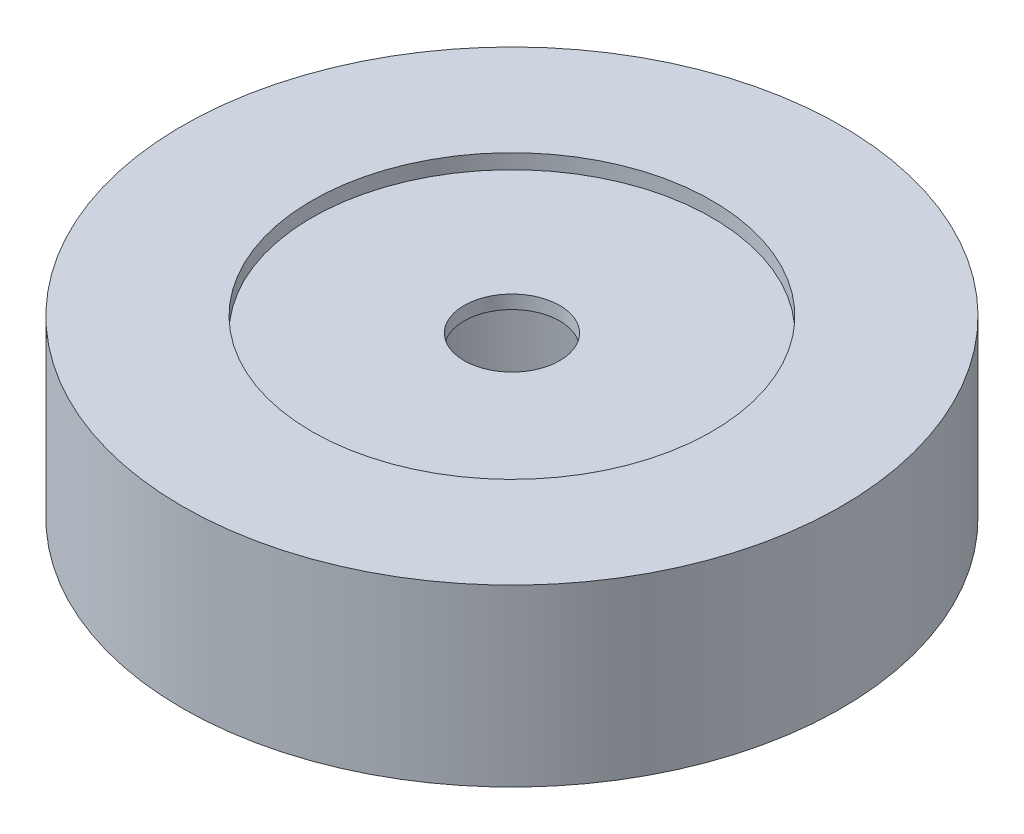
ISO-10303-21;
HEADER;
FILE_DESCRIPTION(('STEP AP214'),'2;1');
FILE_NAME('part.step','',(''),(''),'','','');
FILE_SCHEMA(('AUTOMOTIVE_DESIGN { 1 0 10303 214 1 1 1 1 }'));
ENDSEC;
DATA;
#1=APPLICATION_CONTEXT('core data for automotive mechanical design processes');
#2=APPLICATION_PROTOCOL_DEFINITION('international standard','automotive_design',2000,#1);
#3=PRODUCT_CONTEXT('',#1,'mechanical');
#4=PRODUCT('Part','Part','',(#3));
#5=PRODUCT_RELATED_PRODUCT_CATEGORY('part','',(#4));
#6=PRODUCT_DEFINITION_FORMATION('','',#4);
#7=PRODUCT_DEFINITION_CONTEXT('part definition',#1,'design');
#8=PRODUCT_DEFINITION('design','',#6,#7);
#9=PRODUCT_DEFINITION_SHAPE('','',#8);
#10=(LENGTH_UNIT() NAMED_UNIT(*) SI_UNIT(.MILLI.,.METRE.));
#11=(NAMED_UNIT(*) PLANE_ANGLE_UNIT() SI_UNIT($,.RADIAN.));
#12=(NAMED_UNIT(*) SI_UNIT($,.STERADIAN.) SOLID_ANGLE_UNIT());
#13=UNCERTAINTY_MEASURE_WITH_UNIT(LENGTH_MEASURE(1.E-05),#10,'distance_accuracy_value','');
#14=(GEOMETRIC_REPRESENTATION_CONTEXT(3) GLOBAL_UNCERTAINTY_ASSIGNED_CONTEXT((#13)) GLOBAL_UNIT_ASSIGNED_CONTEXT((#10,
#11,#12)) REPRESENTATION_CONTEXT('',''));
#15=CARTESIAN_POINT('',(0.,0.,0.));
#16=DIRECTION('',(0.,0.,1.));
#17=DIRECTION('',(1.,0.,0.));
#18=AXIS2_PLACEMENT_3D('',#15,#16,#17);
#19=CARTESIAN_POINT('',(0.,120.65,0.));
#20=DIRECTION('',(0.,-1.,0.));
#21=DIRECTION('',(0.,0.,-1.));
#22=AXIS2_PLACEMENT_3D('',#19,#20,#21);
#23=CYLINDRICAL_SURFACE('',#22,33.);
#24=CARTESIAN_POINT('',(0.,101.22,0.));
#25=DIRECTION('',(0.,-1.,0.));
#26=DIRECTION('',(0.,0.,-1.));
#27=AXIS2_PLACEMENT_3D('',#24,#25,#26);
#28=CIRCLE('',#27,33.);
#29=CARTESIAN_POINT('',(0.,101.22,-33.));
#30=VERTEX_POINT('',#29);
#31=EDGE_CURVE('E58',#30,#30,#28,.T.);
#32=ORIENTED_EDGE('',*,*,#31,.T.);
#33=EDGE_LOOP('',(#32));
#34=FACE_BOUND('',#33,.T.);
#35=CARTESIAN_POINT('',(0.,110.49,0.));
#36=DIRECTION('',(0.,1.,0.));
#37=DIRECTION('',(0.,0.,1.));
#38=AXIS2_PLACEMENT_3D('',#35,#36,#37);
#39=CIRCLE('',#38,33.);
#40=CARTESIAN_POINT('',(0.,110.49,33.));
#41=VERTEX_POINT('',#40);
#42=EDGE_CURVE('E47',#41,#41,#39,.T.);
#43=ORIENTED_EDGE('',*,*,#42,.T.);
#44=EDGE_LOOP('',(#43));
#45=FACE_BOUND('',#44,.T.);
#46=ADVANCED_FACE('F43',(#34,#45),#23,.F.);
#47=CARTESIAN_POINT('',(0.,120.65,0.));
#48=DIRECTION('',(0.,1.,0.));
#49=DIRECTION('',(0.,0.,1.));
#50=AXIS2_PLACEMENT_3D('',#47,#48,#49);
#51=PLANE('',#50);
#52=CARTESIAN_POINT('',(0.,120.65,0.));
#53=DIRECTION('',(0.,1.,0.));
#54=DIRECTION('',(0.,0.,1.));
#55=AXIS2_PLACEMENT_3D('',#52,#53,#54);
#56=CIRCLE('',#55,138.);
#57=CARTESIAN_POINT('',(0.,120.65,138.));
#58=VERTEX_POINT('',#57);
#59=EDGE_CURVE('E75',#58,#58,#56,.T.);
#60=ORIENTED_EDGE('',*,*,#59,.F.);
#61=EDGE_LOOP('',(#60));
#62=FACE_BOUND('',#61,.T.);
#63=CARTESIAN_POINT('',(0.,120.65,0.));
#64=DIRECTION('',(0.,1.,0.));
#65=DIRECTION('',(0.,0.,1.));
#66=AXIS2_PLACEMENT_3D('',#63,#64,#65);
#67=CIRCLE('',#66,227.33);
#68=CARTESIAN_POINT('',(0.,120.65,227.33));
#69=VERTEX_POINT('',#68);
#70=EDGE_CURVE('E10',#69,#69,#67,.T.);
#71=ORIENTED_EDGE('',*,*,#70,.T.);
#72=EDGE_LOOP('',(#71));
#73=FACE_BOUND('',#72,.T.);
#74=ADVANCED_FACE('F100',(#62,#73),#51,.T.);
#75=CARTESIAN_POINT('',(0.,0.,0.));
#76=DIRECTION('',(0.,1.,0.));
#77=DIRECTION('',(0.,0.,1.));
#78=AXIS2_PLACEMENT_3D('',#75,#76,#77);
#79=PLANE('',#78);
#80=CARTESIAN_POINT('',(0.,0.,0.));
#81=DIRECTION('',(0.,-1.,0.));
#82=DIRECTION('',(0.,0.,-1.));
#83=AXIS2_PLACEMENT_3D('',#80,#81,#82);
#84=CIRCLE('',#83,120.5);
#85=CARTESIAN_POINT('',(0.,0.,-120.5));
#86=VERTEX_POINT('',#85);
#87=EDGE_CURVE('E61',#86,#86,#84,.T.);
#88=ORIENTED_EDGE('',*,*,#87,.F.);
#89=EDGE_LOOP('',(#88));
#90=FACE_BOUND('',#89,.T.);
#91=CARTESIAN_POINT('',(0.,0.,0.));
#92=DIRECTION('',(0.,1.,0.));
#93=DIRECTION('',(0.,0.,1.));
#94=AXIS2_PLACEMENT_3D('',#91,#92,#93);
#95=CIRCLE('',#94,227.33);
#96=CARTESIAN_POINT('',(0.,0.,227.33));
#97=VERTEX_POINT('',#96);
#98=EDGE_CURVE('E52',#97,#97,#95,.T.);
#99=ORIENTED_EDGE('',*,*,#98,.F.);
#100=EDGE_LOOP('',(#99));
#101=FACE_BOUND('',#100,.T.);
#102=ADVANCED_FACE('F106',(#90,#101),#79,.F.);
#103=CARTESIAN_POINT('',(0.,120.65,0.));
#104=DIRECTION('',(0.,-1.,0.));
#105=DIRECTION('',(0.,0.,-1.));
#106=AXIS2_PLACEMENT_3D('',#103,#104,#105);
#107=CYLINDRICAL_SURFACE('',#106,227.33);
#108=ORIENTED_EDGE('',*,*,#70,.F.);
#109=EDGE_LOOP('',(#108));
#110=FACE_BOUND('',#109,.T.);
#111=ORIENTED_EDGE('',*,*,#98,.T.);
#112=EDGE_LOOP('',(#111));
#113=FACE_BOUND('',#112,.T.);
#114=ADVANCED_FACE('F45',(#110,#113),#107,.T.);
#115=CARTESIAN_POINT('',(0.,101.22,0.));
#116=DIRECTION('',(0.,-1.,0.));
#117=DIRECTION('',(0.,0.,-1.));
#118=AXIS2_PLACEMENT_3D('',#115,#116,#117);
#119=CYLINDRICAL_SURFACE('',#118,120.5);
#120=CARTESIAN_POINT('',(0.,101.22,0.));
#121=DIRECTION('',(0.,-1.,0.));
#122=DIRECTION('',(0.,0.,-1.));
#123=AXIS2_PLACEMENT_3D('',#120,#121,#122);
#124=CIRCLE('',#123,120.5);
#125=CARTESIAN_POINT('',(0.,101.22,-120.5));
#126=VERTEX_POINT('',#125);
#127=EDGE_CURVE('E65',#126,#126,#124,.T.);
#128=ORIENTED_EDGE('',*,*,#127,.F.);
#129=EDGE_LOOP('',(#128));
#130=FACE_BOUND('',#129,.T.);
#131=ORIENTED_EDGE('',*,*,#87,.T.);
#132=EDGE_LOOP('',(#131));
#133=FACE_BOUND('',#132,.T.);
#134=ADVANCED_FACE('F110',(#130,#133),#119,.F.);
#135=CARTESIAN_POINT('',(0.,101.22,0.));
#136=DIRECTION('',(0.,-1.,0.));
#137=DIRECTION('',(0.,0.,-1.));
#138=AXIS2_PLACEMENT_3D('',#135,#136,#137);
#139=PLANE('',#138);
#140=ORIENTED_EDGE('',*,*,#31,.F.);
#141=EDGE_LOOP('',(#140));
#142=FACE_BOUND('',#141,.T.);
#143=ORIENTED_EDGE('',*,*,#127,.T.);
#144=EDGE_LOOP('',(#143));
#145=FACE_BOUND('',#144,.T.);
#146=ADVANCED_FACE('F96',(#142,#145),#139,.T.);
#147=CARTESIAN_POINT('',(0.,110.49,0.));
#148=DIRECTION('',(0.,1.,0.));
#149=DIRECTION('',(0.,0.,1.));
#150=AXIS2_PLACEMENT_3D('',#147,#148,#149);
#151=CYLINDRICAL_SURFACE('',#150,138.);
#152=CARTESIAN_POINT('',(0.,110.49,0.));
#153=DIRECTION('',(0.,1.,0.));
#154=DIRECTION('',(0.,0.,1.));
#155=AXIS2_PLACEMENT_3D('',#152,#153,#154);
#156=CIRCLE('',#155,138.);
#157=CARTESIAN_POINT('',(0.,110.49,138.));
#158=VERTEX_POINT('',#157);
#159=EDGE_CURVE('E79',#158,#158,#156,.T.);
#160=ORIENTED_EDGE('',*,*,#159,.F.);
#161=EDGE_LOOP('',(#160));
#162=FACE_BOUND('',#161,.T.);
#163=ORIENTED_EDGE('',*,*,#59,.T.);
#164=EDGE_LOOP('',(#163));
#165=FACE_BOUND('',#164,.T.);
#166=ADVANCED_FACE('F91',(#162,#165),#151,.F.);
#167=CARTESIAN_POINT('',(0.,110.49,0.));
#168=DIRECTION('',(0.,1.,0.));
#169=DIRECTION('',(0.,0.,1.));
#170=AXIS2_PLACEMENT_3D('',#167,#168,#169);
#171=PLANE('',#170);
#172=ORIENTED_EDGE('',*,*,#42,.F.);
#173=EDGE_LOOP('',(#172));
#174=FACE_BOUND('',#173,.T.);
#175=ORIENTED_EDGE('',*,*,#159,.T.);
#176=EDGE_LOOP('',(#175));
#177=FACE_BOUND('',#176,.T.);
#178=ADVANCED_FACE('F89',(#174,#177),#171,.T.);
#179=CLOSED_SHELL('',(#46,#74,#102,#114,#134,#146,#166,#178));
#180=MANIFOLD_SOLID_BREP('B2',#179);
#181=ADVANCED_BREP_SHAPE_REPRESENTATION('',(#18,#180),#14);
#182=SHAPE_DEFINITION_REPRESENTATION(#9,#181);
ENDSEC;
END-ISO-10303-21;
